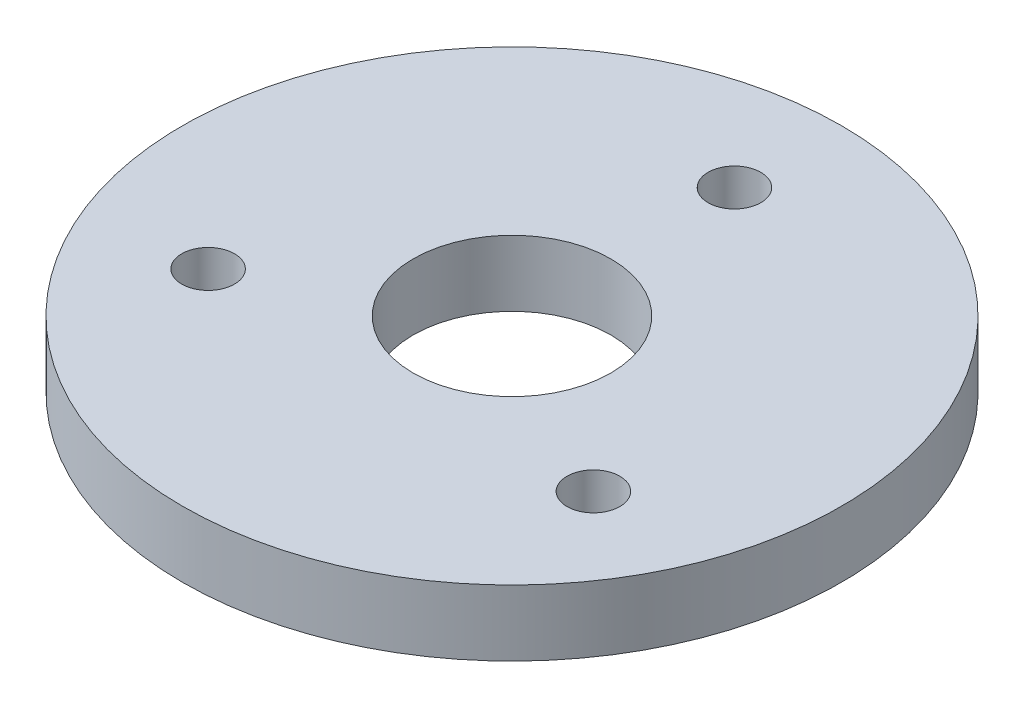
ISO-10303-21;
HEADER;
FILE_DESCRIPTION(('STEP AP214'),'2;1');
FILE_NAME('part.step','',(''),(''),'','','');
FILE_SCHEMA(('AUTOMOTIVE_DESIGN { 1 0 10303 214 1 1 1 1 }'));
ENDSEC;
DATA;
#1=APPLICATION_CONTEXT('core data for automotive mechanical design processes');
#2=APPLICATION_PROTOCOL_DEFINITION('international standard','automotive_design',2000,#1);
#3=PRODUCT_CONTEXT('',#1,'mechanical');
#4=PRODUCT('Part','Part','',(#3));
#5=PRODUCT_RELATED_PRODUCT_CATEGORY('part','',(#4));
#6=PRODUCT_DEFINITION_FORMATION('','',#4);
#7=PRODUCT_DEFINITION_CONTEXT('part definition',#1,'design');
#8=PRODUCT_DEFINITION('design','',#6,#7);
#9=PRODUCT_DEFINITION_SHAPE('','',#8);
#10=(LENGTH_UNIT() NAMED_UNIT(*) SI_UNIT(.MILLI.,.METRE.));
#11=(NAMED_UNIT(*) PLANE_ANGLE_UNIT() SI_UNIT($,.RADIAN.));
#12=(NAMED_UNIT(*) SI_UNIT($,.STERADIAN.) SOLID_ANGLE_UNIT());
#13=UNCERTAINTY_MEASURE_WITH_UNIT(LENGTH_MEASURE(1.E-05),#10,'distance_accuracy_value','');
#14=(GEOMETRIC_REPRESENTATION_CONTEXT(3) GLOBAL_UNCERTAINTY_ASSIGNED_CONTEXT((#13)) GLOBAL_UNIT_ASSIGNED_CONTEXT((#10,
#11,#12)) REPRESENTATION_CONTEXT('',''));
#15=CARTESIAN_POINT('',(0.,0.,0.));
#16=DIRECTION('',(0.,0.,1.));
#17=DIRECTION('',(1.,0.,0.));
#18=AXIS2_PLACEMENT_3D('',#15,#16,#17);
#19=CARTESIAN_POINT('',(0.,4.,0.));
#20=DIRECTION('',(0.,1.,0.));
#21=DIRECTION('',(0.,0.,1.));
#22=AXIS2_PLACEMENT_3D('',#19,#20,#21);
#23=PLANE('',#22);
#24=CARTESIAN_POINT('',(11.6913429510899,4.,6.75));
#25=DIRECTION('',(0.,1.,0.));
#26=DIRECTION('',(0.,0.,1.));
#27=AXIS2_PLACEMENT_3D('',#24,#25,#26);
#28=CIRCLE('',#27,1.6);
#29=CARTESIAN_POINT('',(11.6913429510899,4.,8.35));
#30=VERTEX_POINT('',#29);
#31=EDGE_CURVE('E64',#30,#30,#28,.T.);
#32=ORIENTED_EDGE('',*,*,#31,.F.);
#33=EDGE_LOOP('',(#32));
#34=FACE_BOUND('',#33,.T.);
#35=CARTESIAN_POINT('',(0.,4.,-13.5));
#36=DIRECTION('',(0.,1.,0.));
#37=DIRECTION('',(0.,0.,1.));
#38=AXIS2_PLACEMENT_3D('',#35,#36,#37);
#39=CIRCLE('',#38,1.6);
#40=CARTESIAN_POINT('',(0.,4.,-11.9));
#41=VERTEX_POINT('',#40);
#42=EDGE_CURVE('E50',#41,#41,#39,.T.);
#43=ORIENTED_EDGE('',*,*,#42,.F.);
#44=EDGE_LOOP('',(#43));
#45=FACE_BOUND('',#44,.T.);
#46=CARTESIAN_POINT('',(0.,4.,0.));
#47=DIRECTION('',(0.,1.,0.));
#48=DIRECTION('',(0.,0.,1.));
#49=AXIS2_PLACEMENT_3D('',#46,#47,#48);
#50=CIRCLE('',#49,20.);
#51=CARTESIAN_POINT('',(0.,4.,20.));
#52=VERTEX_POINT('',#51);
#53=EDGE_CURVE('E10',#52,#52,#50,.T.);
#54=ORIENTED_EDGE('',*,*,#53,.T.);
#55=EDGE_LOOP('',(#54));
#56=FACE_BOUND('',#55,.T.);
#57=CARTESIAN_POINT('',(0.,4.,0.));
#58=DIRECTION('',(0.,1.,0.));
#59=DIRECTION('',(0.,0.,1.));
#60=AXIS2_PLACEMENT_3D('',#57,#58,#59);
#61=CIRCLE('',#60,6.);
#62=CARTESIAN_POINT('',(0.,4.,6.));
#63=VERTEX_POINT('',#62);
#64=EDGE_CURVE('E56',#63,#63,#61,.T.);
#65=ORIENTED_EDGE('',*,*,#64,.F.);
#66=EDGE_LOOP('',(#65));
#67=FACE_BOUND('',#66,.T.);
#68=CARTESIAN_POINT('',(-11.6913429510899,4.,6.75000000000001));
#69=DIRECTION('',(0.,1.,0.));
#70=DIRECTION('',(0.,0.,1.));
#71=AXIS2_PLACEMENT_3D('',#68,#69,#70);
#72=CIRCLE('',#71,1.6);
#73=CARTESIAN_POINT('',(-11.6913429510899,4.,8.35000000000001));
#74=VERTEX_POINT('',#73);
#75=EDGE_CURVE('E72',#74,#74,#72,.T.);
#76=ORIENTED_EDGE('',*,*,#75,.F.);
#77=EDGE_LOOP('',(#76));
#78=FACE_BOUND('',#77,.T.);
#79=ADVANCED_FACE('F37',(#34,#45,#56,#67,#78),#23,.T.);
#80=CARTESIAN_POINT('',(0.,0.,0.));
#81=DIRECTION('',(0.,1.,0.));
#82=DIRECTION('',(0.,0.,1.));
#83=AXIS2_PLACEMENT_3D('',#80,#81,#82);
#84=PLANE('',#83);
#85=CARTESIAN_POINT('',(0.,0.,0.));
#86=DIRECTION('',(0.,1.,0.));
#87=DIRECTION('',(0.,0.,1.));
#88=AXIS2_PLACEMENT_3D('',#85,#86,#87);
#89=CIRCLE('',#88,20.);
#90=CARTESIAN_POINT('',(0.,0.,20.));
#91=VERTEX_POINT('',#90);
#92=EDGE_CURVE('E41',#91,#91,#89,.T.);
#93=ORIENTED_EDGE('',*,*,#92,.F.);
#94=EDGE_LOOP('',(#93));
#95=FACE_BOUND('',#94,.T.);
#96=CARTESIAN_POINT('',(0.,0.,-13.5));
#97=DIRECTION('',(0.,1.,0.));
#98=DIRECTION('',(0.,0.,1.));
#99=AXIS2_PLACEMENT_3D('',#96,#97,#98);
#100=CIRCLE('',#99,1.6);
#101=CARTESIAN_POINT('',(0.,0.,-11.9));
#102=VERTEX_POINT('',#101);
#103=EDGE_CURVE('E52',#102,#102,#100,.T.);
#104=ORIENTED_EDGE('',*,*,#103,.T.);
#105=EDGE_LOOP('',(#104));
#106=FACE_BOUND('',#105,.T.);
#107=CARTESIAN_POINT('',(0.,0.,0.));
#108=DIRECTION('',(0.,1.,0.));
#109=DIRECTION('',(0.,0.,1.));
#110=AXIS2_PLACEMENT_3D('',#107,#108,#109);
#111=CIRCLE('',#110,6.);
#112=CARTESIAN_POINT('',(0.,0.,6.));
#113=VERTEX_POINT('',#112);
#114=EDGE_CURVE('E60',#113,#113,#111,.T.);
#115=ORIENTED_EDGE('',*,*,#114,.T.);
#116=EDGE_LOOP('',(#115));
#117=FACE_BOUND('',#116,.T.);
#118=CARTESIAN_POINT('',(11.6913429510899,0.,6.75));
#119=DIRECTION('',(0.,1.,0.));
#120=DIRECTION('',(0.,0.,1.));
#121=AXIS2_PLACEMENT_3D('',#118,#119,#120);
#122=CIRCLE('',#121,1.6);
#123=CARTESIAN_POINT('',(11.6913429510899,0.,8.35));
#124=VERTEX_POINT('',#123);
#125=EDGE_CURVE('E68',#124,#124,#122,.T.);
#126=ORIENTED_EDGE('',*,*,#125,.T.);
#127=EDGE_LOOP('',(#126));
#128=FACE_BOUND('',#127,.T.);
#129=CARTESIAN_POINT('',(-11.6913429510899,0.,6.75000000000001));
#130=DIRECTION('',(0.,1.,0.));
#131=DIRECTION('',(0.,0.,1.));
#132=AXIS2_PLACEMENT_3D('',#129,#130,#131);
#133=CIRCLE('',#132,1.6);
#134=CARTESIAN_POINT('',(-11.6913429510899,0.,8.35000000000001));
#135=VERTEX_POINT('',#134);
#136=EDGE_CURVE('E76',#135,#135,#133,.T.);
#137=ORIENTED_EDGE('',*,*,#136,.T.);
#138=EDGE_LOOP('',(#137));
#139=FACE_BOUND('',#138,.T.);
#140=ADVANCED_FACE('F88',(#95,#106,#117,#128,#139),#84,.F.);
#141=CARTESIAN_POINT('',(0.,4.,0.));
#142=DIRECTION('',(0.,-1.,0.));
#143=DIRECTION('',(0.,0.,-1.));
#144=AXIS2_PLACEMENT_3D('',#141,#142,#143);
#145=CYLINDRICAL_SURFACE('',#144,20.);
#146=ORIENTED_EDGE('',*,*,#53,.F.);
#147=EDGE_LOOP('',(#146));
#148=FACE_BOUND('',#147,.T.);
#149=ORIENTED_EDGE('',*,*,#92,.T.);
#150=EDGE_LOOP('',(#149));
#151=FACE_BOUND('',#150,.T.);
#152=ADVANCED_FACE('F39',(#148,#151),#145,.T.);
#153=CARTESIAN_POINT('',(0.,4.,-13.5));
#154=DIRECTION('',(0.,-1.,0.));
#155=DIRECTION('',(0.,0.,-1.));
#156=AXIS2_PLACEMENT_3D('',#153,#154,#155);
#157=CYLINDRICAL_SURFACE('',#156,1.6);
#158=ORIENTED_EDGE('',*,*,#42,.T.);
#159=EDGE_LOOP('',(#158));
#160=FACE_BOUND('',#159,.T.);
#161=ORIENTED_EDGE('',*,*,#103,.F.);
#162=EDGE_LOOP('',(#161));
#163=FACE_BOUND('',#162,.T.);
#164=ADVANCED_FACE('F98',(#160,#163),#157,.F.);
#165=CARTESIAN_POINT('',(0.,4.,0.));
#166=DIRECTION('',(0.,-1.,0.));
#167=DIRECTION('',(0.,0.,-1.));
#168=AXIS2_PLACEMENT_3D('',#165,#166,#167);
#169=CYLINDRICAL_SURFACE('',#168,6.);
#170=ORIENTED_EDGE('',*,*,#64,.T.);
#171=EDGE_LOOP('',(#170));
#172=FACE_BOUND('',#171,.T.);
#173=ORIENTED_EDGE('',*,*,#114,.F.);
#174=EDGE_LOOP('',(#173));
#175=FACE_BOUND('',#174,.T.);
#176=ADVANCED_FACE('F101',(#172,#175),#169,.F.);
#177=CARTESIAN_POINT('',(11.6913429510899,4.,6.75));
#178=DIRECTION('',(0.,-1.,0.));
#179=DIRECTION('',(0.,0.,-1.));
#180=AXIS2_PLACEMENT_3D('',#177,#178,#179);
#181=CYLINDRICAL_SURFACE('',#180,1.6);
#182=ORIENTED_EDGE('',*,*,#31,.T.);
#183=EDGE_LOOP('',(#182));
#184=FACE_BOUND('',#183,.T.);
#185=ORIENTED_EDGE('',*,*,#125,.F.);
#186=EDGE_LOOP('',(#185));
#187=FACE_BOUND('',#186,.T.);
#188=ADVANCED_FACE('F105',(#184,#187),#181,.F.);
#189=CARTESIAN_POINT('',(-11.6913429510899,4.,6.75000000000001));
#190=DIRECTION('',(0.,-1.,0.));
#191=DIRECTION('',(0.,0.,-1.));
#192=AXIS2_PLACEMENT_3D('',#189,#190,#191);
#193=CYLINDRICAL_SURFACE('',#192,1.6);
#194=ORIENTED_EDGE('',*,*,#75,.T.);
#195=EDGE_LOOP('',(#194));
#196=FACE_BOUND('',#195,.T.);
#197=ORIENTED_EDGE('',*,*,#136,.F.);
#198=EDGE_LOOP('',(#197));
#199=FACE_BOUND('',#198,.T.);
#200=ADVANCED_FACE('F84',(#196,#199),#193,.F.);
#201=CLOSED_SHELL('',(#79,#140,#152,#164,#176,#188,#200));
#202=MANIFOLD_SOLID_BREP('B2',#201);
#203=ADVANCED_BREP_SHAPE_REPRESENTATION('',(#18,#202),#14);
#204=SHAPE_DEFINITION_REPRESENTATION(#9,#203);
ENDSEC;
END-ISO-10303-21;
